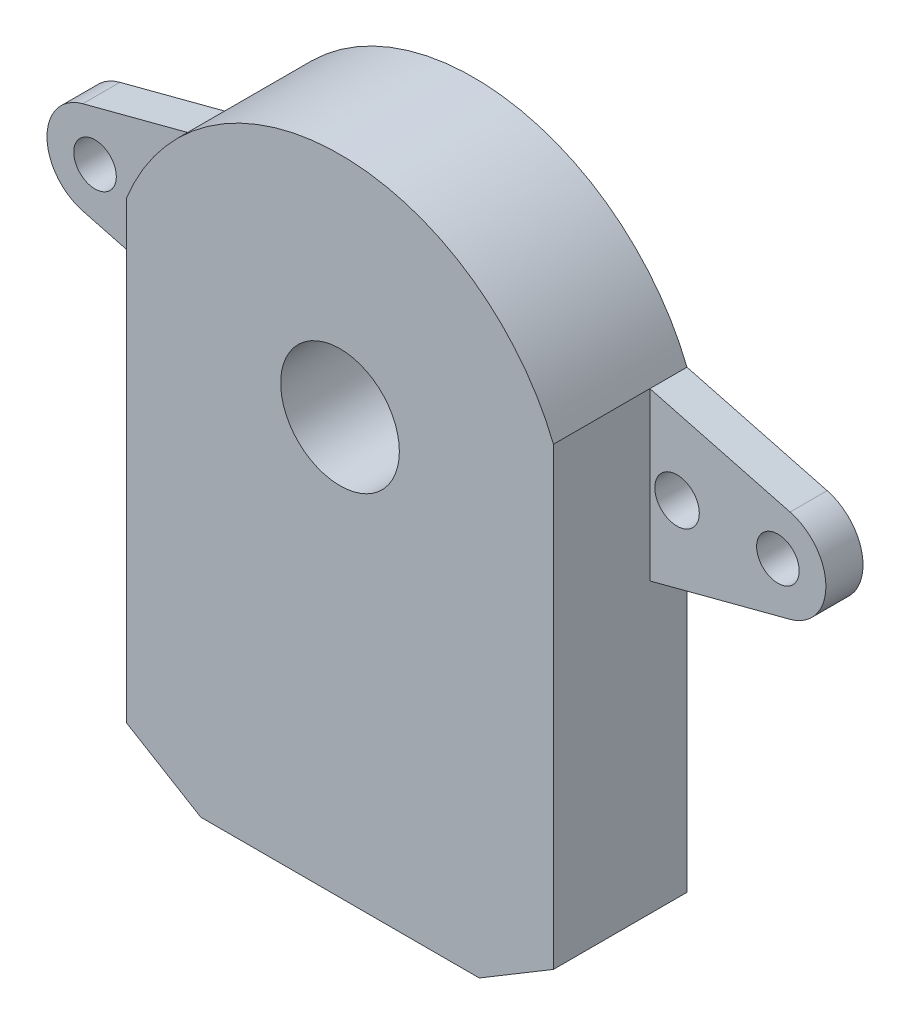
ISO-10303-21;
HEADER;
FILE_DESCRIPTION(('STEP AP214'),'2;1');
FILE_NAME('part.step','',(''),(''),'','','');
FILE_SCHEMA(('AUTOMOTIVE_DESIGN { 1 0 10303 214 1 1 1 1 }'));
ENDSEC;
DATA;
#1=APPLICATION_CONTEXT('core data for automotive mechanical design processes');
#2=APPLICATION_PROTOCOL_DEFINITION('international standard','automotive_design',2000,#1);
#3=PRODUCT_CONTEXT('',#1,'mechanical');
#4=PRODUCT('Part','Part','',(#3));
#5=PRODUCT_RELATED_PRODUCT_CATEGORY('part','',(#4));
#6=PRODUCT_DEFINITION_FORMATION('','',#4);
#7=PRODUCT_DEFINITION_CONTEXT('part definition',#1,'design');
#8=PRODUCT_DEFINITION('design','',#6,#7);
#9=PRODUCT_DEFINITION_SHAPE('','',#8);
#10=(LENGTH_UNIT() NAMED_UNIT(*) SI_UNIT(.MILLI.,.METRE.));
#11=(NAMED_UNIT(*) PLANE_ANGLE_UNIT() SI_UNIT($,.RADIAN.));
#12=(NAMED_UNIT(*) SI_UNIT($,.STERADIAN.) SOLID_ANGLE_UNIT());
#13=UNCERTAINTY_MEASURE_WITH_UNIT(LENGTH_MEASURE(1.E-05),#10,'distance_accuracy_value','');
#14=(GEOMETRIC_REPRESENTATION_CONTEXT(3) GLOBAL_UNCERTAINTY_ASSIGNED_CONTEXT((#13)) GLOBAL_UNIT_ASSIGNED_CONTEXT((#10,
#11,#12)) REPRESENTATION_CONTEXT('',''));
#15=CARTESIAN_POINT('',(0.,0.,0.));
#16=DIRECTION('',(0.,0.,1.));
#17=DIRECTION('',(1.,0.,0.));
#18=AXIS2_PLACEMENT_3D('',#15,#16,#17);
#19=CARTESIAN_POINT('',(-14.385,5.61250162407946,9.));
#20=DIRECTION('',(0.253955475555715,-0.967215909937006,0.));
#21=DIRECTION('',(0.967215909937006,0.253955475555716,0.));
#22=AXIS2_PLACEMENT_3D('',#19,#20,#21);
#23=PLANE('',#22);
#24=DIRECTION('',(-0.967215909937006,-0.253955475555715,0.));
#25=VECTOR('',#24,1.);
#26=CARTESIAN_POINT('',(-14.385,5.61250162407946,2.5));
#27=LINE('',#26,#25);
#28=CARTESIAN_POINT('',(-14.385,5.61250162407946,2.5));
#29=VERTEX_POINT('',#28);
#30=CARTESIAN_POINT('',(-23.8346808521116,3.13136150842106,2.5));
#31=VERTEX_POINT('',#30);
#32=EDGE_CURVE('E267',#29,#31,#27,.T.);
#33=ORIENTED_EDGE('',*,*,#32,.F.);
#34=DIRECTION('',(0.,0.,-1.));
#35=VECTOR('',#34,1.);
#36=CARTESIAN_POINT('',(-14.385,5.61250162407946,9.));
#37=LINE('',#36,#35);
#38=CARTESIAN_POINT('',(-14.385,5.61250162407946,0.));
#39=VERTEX_POINT('',#38);
#40=EDGE_CURVE('E180',#29,#39,#37,.T.);
#41=ORIENTED_EDGE('',*,*,#40,.T.);
#42=DIRECTION('',(-0.967215909937006,-0.253955475555715,0.));
#43=VECTOR('',#42,1.);
#44=CARTESIAN_POINT('',(-14.385,5.61250162407946,0.));
#45=LINE('',#44,#43);
#46=CARTESIAN_POINT('',(-23.8346808521116,3.13136150842106,0.));
#47=VERTEX_POINT('',#46);
#48=EDGE_CURVE('E243',#39,#47,#45,.T.);
#49=ORIENTED_EDGE('',*,*,#48,.T.);
#50=DIRECTION('',(0.,0.,-1.));
#51=VECTOR('',#50,1.);
#52=CARTESIAN_POINT('',(-23.8346808521116,3.13136150842106,9.));
#53=LINE('',#52,#51);
#54=EDGE_CURVE('E178',#31,#47,#53,.T.);
#55=ORIENTED_EDGE('',*,*,#54,.F.);
#56=EDGE_LOOP('',(#33,#41,#49,#55));
#57=FACE_BOUND('',#56,.T.);
#58=ADVANCED_FACE('F35',(#57),#23,.F.);
#59=CARTESIAN_POINT('',(-23.0125,0.,9.));
#60=DIRECTION('',(0.,0.,-1.));
#61=DIRECTION('',(-1.,0.,0.));
#62=AXIS2_PLACEMENT_3D('',#59,#60,#61);
#63=CYLINDRICAL_SURFACE('',#62,3.2375);
#64=CARTESIAN_POINT('',(-23.0125,0.,2.5));
#65=DIRECTION('',(0.,0.,1.));
#66=DIRECTION('',(1.,0.,0.));
#67=AXIS2_PLACEMENT_3D('',#64,#65,#66);
#68=CIRCLE('',#67,3.23750000000001);
#69=CARTESIAN_POINT('',(-23.8346808521116,-3.13136150842107,2.5));
#70=VERTEX_POINT('',#69);
#71=EDGE_CURVE('E273',#31,#70,#68,.T.);
#72=ORIENTED_EDGE('',*,*,#71,.F.);
#73=ORIENTED_EDGE('',*,*,#54,.T.);
#74=CARTESIAN_POINT('',(-23.0125,0.,0.));
#75=DIRECTION('',(0.,0.,1.));
#76=DIRECTION('',(1.,0.,0.));
#77=AXIS2_PLACEMENT_3D('',#74,#75,#76);
#78=CIRCLE('',#77,3.2375);
#79=CARTESIAN_POINT('',(-23.8346808521116,-3.13136150842106,0.));
#80=VERTEX_POINT('',#79);
#81=EDGE_CURVE('E247',#47,#80,#78,.T.);
#82=ORIENTED_EDGE('',*,*,#81,.T.);
#83=DIRECTION('',(0.,0.,-1.));
#84=VECTOR('',#83,1.);
#85=CARTESIAN_POINT('',(-23.8346808521116,-3.13136150842106,9.));
#86=LINE('',#85,#84);
#87=EDGE_CURVE('E176',#70,#80,#86,.T.);
#88=ORIENTED_EDGE('',*,*,#87,.F.);
#89=EDGE_LOOP('',(#72,#73,#82,#88));
#90=FACE_BOUND('',#89,.T.);
#91=ADVANCED_FACE('F276',(#90),#63,.T.);
#92=CARTESIAN_POINT('',(-23.8346808521116,-3.13136150842106,9.));
#93=DIRECTION('',(0.253955475555715,0.967215909937006,0.));
#94=DIRECTION('',(-0.967215909937006,0.253955475555715,0.));
#95=AXIS2_PLACEMENT_3D('',#92,#93,#94);
#96=PLANE('',#95);
#97=DIRECTION('',(0.967215909937006,-0.253955475555714,0.));
#98=VECTOR('',#97,1.);
#99=CARTESIAN_POINT('',(-23.8346808521116,-3.13136150842107,2.5));
#100=LINE('',#99,#98);
#101=CARTESIAN_POINT('',(-14.385,-5.61250162407945,2.5));
#102=VERTEX_POINT('',#101);
#103=EDGE_CURVE('E150',#70,#102,#100,.T.);
#104=ORIENTED_EDGE('',*,*,#103,.F.);
#105=ORIENTED_EDGE('',*,*,#87,.T.);
#106=DIRECTION('',(0.967215909937006,-0.253955475555715,0.));
#107=VECTOR('',#106,1.);
#108=CARTESIAN_POINT('',(-23.8346808521116,-3.13136150842106,0.));
#109=LINE('',#108,#107);
#110=CARTESIAN_POINT('',(-14.385,-5.61250162407945,0.));
#111=VERTEX_POINT('',#110);
#112=EDGE_CURVE('E222',#80,#111,#109,.T.);
#113=ORIENTED_EDGE('',*,*,#112,.T.);
#114=DIRECTION('',(0.,0.,-1.));
#115=VECTOR('',#114,1.);
#116=CARTESIAN_POINT('',(-14.385,-5.61250162407945,9.));
#117=LINE('',#116,#115);
#118=EDGE_CURVE('E174',#102,#111,#117,.T.);
#119=ORIENTED_EDGE('',*,*,#118,.F.);
#120=EDGE_LOOP('',(#104,#105,#113,#119));
#121=FACE_BOUND('',#120,.T.);
#122=ADVANCED_FACE('F254',(#121),#96,.F.);
#123=CARTESIAN_POINT('',(23.8346808521116,-3.13136150842106,9.));
#124=DIRECTION('',(-0.253955475555715,0.967215909937006,0.));
#125=DIRECTION('',(-0.967215909937006,-0.253955475555716,0.));
#126=AXIS2_PLACEMENT_3D('',#123,#124,#125);
#127=PLANE('',#126);
#128=DIRECTION('',(0.967215909937006,0.253955475555715,0.));
#129=VECTOR('',#128,1.);
#130=CARTESIAN_POINT('',(14.385,-5.61250162407946,2.5));
#131=LINE('',#130,#129);
#132=CARTESIAN_POINT('',(14.385,-5.61250162407946,2.5));
#133=VERTEX_POINT('',#132);
#134=CARTESIAN_POINT('',(23.8346808521116,-3.13136150842106,2.5));
#135=VERTEX_POINT('',#134);
#136=EDGE_CURVE('E140',#133,#135,#131,.T.);
#137=ORIENTED_EDGE('',*,*,#136,.F.);
#138=DIRECTION('',(0.,0.,-1.));
#139=VECTOR('',#138,1.);
#140=CARTESIAN_POINT('',(14.385,-5.61250162407946,9.));
#141=LINE('',#140,#139);
#142=CARTESIAN_POINT('',(14.385,-5.61250162407946,0.));
#143=VERTEX_POINT('',#142);
#144=EDGE_CURVE('E137',#133,#143,#141,.T.);
#145=ORIENTED_EDGE('',*,*,#144,.T.);
#146=DIRECTION('',(0.967215909937006,0.253955475555715,0.));
#147=VECTOR('',#146,1.);
#148=CARTESIAN_POINT('',(23.8346808521116,-3.13136150842106,0.));
#149=LINE('',#148,#147);
#150=CARTESIAN_POINT('',(23.8346808521116,-3.13136150842106,0.));
#151=VERTEX_POINT('',#150);
#152=EDGE_CURVE('E220',#143,#151,#149,.T.);
#153=ORIENTED_EDGE('',*,*,#152,.T.);
#154=DIRECTION('',(0.,0.,-1.));
#155=VECTOR('',#154,1.);
#156=CARTESIAN_POINT('',(23.8346808521116,-3.13136150842106,9.));
#157=LINE('',#156,#155);
#158=EDGE_CURVE('E167',#135,#151,#157,.T.);
#159=ORIENTED_EDGE('',*,*,#158,.F.);
#160=EDGE_LOOP('',(#137,#145,#153,#159));
#161=FACE_BOUND('',#160,.T.);
#162=ADVANCED_FACE('F337',(#161),#127,.F.);
#163=CARTESIAN_POINT('',(23.0125,0.,9.));
#164=DIRECTION('',(0.,0.,-1.));
#165=DIRECTION('',(-1.,0.,0.));
#166=AXIS2_PLACEMENT_3D('',#163,#164,#165);
#167=CYLINDRICAL_SURFACE('',#166,3.2375);
#168=CARTESIAN_POINT('',(23.0125,0.,2.5));
#169=DIRECTION('',(0.,0.,1.));
#170=DIRECTION('',(1.,0.,0.));
#171=AXIS2_PLACEMENT_3D('',#168,#169,#170);
#172=CIRCLE('',#171,3.2375);
#173=CARTESIAN_POINT('',(23.8346808521116,3.13136150842106,2.5));
#174=VERTEX_POINT('',#173);
#175=EDGE_CURVE('E147',#135,#174,#172,.T.);
#176=ORIENTED_EDGE('',*,*,#175,.F.);
#177=ORIENTED_EDGE('',*,*,#158,.T.);
#178=CARTESIAN_POINT('',(23.0125,0.,0.));
#179=DIRECTION('',(0.,0.,1.));
#180=DIRECTION('',(-1.,0.,0.));
#181=AXIS2_PLACEMENT_3D('',#178,#179,#180);
#182=CIRCLE('',#181,3.2375);
#183=CARTESIAN_POINT('',(23.8346808521116,3.13136150842106,0.));
#184=VERTEX_POINT('',#183);
#185=EDGE_CURVE('E227',#151,#184,#182,.T.);
#186=ORIENTED_EDGE('',*,*,#185,.T.);
#187=DIRECTION('',(0.,0.,-1.));
#188=VECTOR('',#187,1.);
#189=CARTESIAN_POINT('',(23.8346808521116,3.13136150842106,9.));
#190=LINE('',#189,#188);
#191=EDGE_CURVE('E166',#174,#184,#190,.T.);
#192=ORIENTED_EDGE('',*,*,#191,.F.);
#193=EDGE_LOOP('',(#176,#177,#186,#192));
#194=FACE_BOUND('',#193,.T.);
#195=ADVANCED_FACE('F340',(#194),#167,.T.);
#196=CARTESIAN_POINT('',(14.385,5.61250162407946,9.));
#197=DIRECTION('',(-0.253955475555716,-0.967215909937006,0.));
#198=DIRECTION('',(0.967215909937006,-0.253955475555716,0.));
#199=AXIS2_PLACEMENT_3D('',#196,#197,#198);
#200=PLANE('',#199);
#201=DIRECTION('',(-0.967215909937006,0.253955475555716,0.));
#202=VECTOR('',#201,1.);
#203=CARTESIAN_POINT('',(23.8346808521116,3.13136150842106,2.5));
#204=LINE('',#203,#202);
#205=CARTESIAN_POINT('',(14.385,5.61250162407946,2.5));
#206=VERTEX_POINT('',#205);
#207=EDGE_CURVE('E141',#174,#206,#204,.T.);
#208=ORIENTED_EDGE('',*,*,#207,.F.);
#209=ORIENTED_EDGE('',*,*,#191,.T.);
#210=DIRECTION('',(-0.967215909937006,0.253955475555716,0.));
#211=VECTOR('',#210,1.);
#212=CARTESIAN_POINT('',(14.385,5.61250162407946,0.));
#213=LINE('',#212,#211);
#214=CARTESIAN_POINT('',(14.385,5.61250162407946,0.));
#215=VERTEX_POINT('',#214);
#216=EDGE_CURVE('E156',#184,#215,#213,.T.);
#217=ORIENTED_EDGE('',*,*,#216,.T.);
#218=DIRECTION('',(0.,0.,-1.));
#219=VECTOR('',#218,1.);
#220=CARTESIAN_POINT('',(14.385,5.61250162407946,9.));
#221=LINE('',#220,#219);
#222=EDGE_CURVE('E153',#206,#215,#221,.T.);
#223=ORIENTED_EDGE('',*,*,#222,.F.);
#224=EDGE_LOOP('',(#208,#209,#217,#223));
#225=FACE_BOUND('',#224,.T.);
#226=ADVANCED_FACE('F154',(#225),#200,.F.);
#227=CARTESIAN_POINT('',(-23.0125,0.,9.));
#228=DIRECTION('',(0.,0.,-1.));
#229=DIRECTION('',(-1.,0.,0.));
#230=AXIS2_PLACEMENT_3D('',#227,#228,#229);
#231=CYLINDRICAL_SURFACE('',#230,1.435);
#232=CARTESIAN_POINT('',(-23.0125,0.,0.));
#233=DIRECTION('',(0.,0.,1.));
#234=DIRECTION('',(1.,0.,0.));
#235=AXIS2_PLACEMENT_3D('',#232,#233,#234);
#236=CIRCLE('',#235,1.435);
#237=CARTESIAN_POINT('',(-21.5775,0.,0.));
#238=VERTEX_POINT('',#237);
#239=EDGE_CURVE('E293',#238,#238,#236,.T.);
#240=ORIENTED_EDGE('',*,*,#239,.F.);
#241=EDGE_LOOP('',(#240));
#242=FACE_BOUND('',#241,.T.);
#243=CARTESIAN_POINT('',(-23.0125,0.,2.5));
#244=DIRECTION('',(0.,0.,1.));
#245=DIRECTION('',(1.,0.,0.));
#246=AXIS2_PLACEMENT_3D('',#243,#244,#245);
#247=CIRCLE('',#246,1.435);
#248=CARTESIAN_POINT('',(-21.5775,0.,2.5));
#249=VERTEX_POINT('',#248);
#250=EDGE_CURVE('E187',#249,#249,#247,.T.);
#251=ORIENTED_EDGE('',*,*,#250,.T.);
#252=EDGE_LOOP('',(#251));
#253=FACE_BOUND('',#252,.T.);
#254=ADVANCED_FACE('F347',(#242,#253),#231,.F.);
#255=CARTESIAN_POINT('',(23.0125,0.,9.));
#256=DIRECTION('',(0.,0.,-1.));
#257=DIRECTION('',(-1.,0.,0.));
#258=AXIS2_PLACEMENT_3D('',#255,#256,#257);
#259=CYLINDRICAL_SURFACE('',#258,1.43499999999999);
#260=CARTESIAN_POINT('',(23.0125,0.,0.));
#261=DIRECTION('',(0.,0.,1.));
#262=DIRECTION('',(1.,0.,0.));
#263=AXIS2_PLACEMENT_3D('',#260,#261,#262);
#264=CIRCLE('',#263,1.43499999999999);
#265=CARTESIAN_POINT('',(24.4475,0.,0.));
#266=VERTEX_POINT('',#265);
#267=EDGE_CURVE('E290',#266,#266,#264,.T.);
#268=ORIENTED_EDGE('',*,*,#267,.F.);
#269=EDGE_LOOP('',(#268));
#270=FACE_BOUND('',#269,.T.);
#271=CARTESIAN_POINT('',(23.0125,0.,2.5));
#272=DIRECTION('',(0.,0.,1.));
#273=DIRECTION('',(1.,0.,0.));
#274=AXIS2_PLACEMENT_3D('',#271,#272,#273);
#275=CIRCLE('',#274,1.43499999999999);
#276=CARTESIAN_POINT('',(24.4475,0.,2.5));
#277=VERTEX_POINT('',#276);
#278=EDGE_CURVE('E191',#277,#277,#275,.T.);
#279=ORIENTED_EDGE('',*,*,#278,.T.);
#280=EDGE_LOOP('',(#279));
#281=FACE_BOUND('',#280,.T.);
#282=ADVANCED_FACE('F383',(#270,#281),#259,.F.);
#283=CARTESIAN_POINT('',(16.215,0.,9.));
#284=DIRECTION('',(0.,0.,-1.));
#285=DIRECTION('',(-1.,0.,0.));
#286=AXIS2_PLACEMENT_3D('',#283,#284,#285);
#287=CYLINDRICAL_SURFACE('',#286,1.5);
#288=CARTESIAN_POINT('',(16.215,0.,0.));
#289=DIRECTION('',(0.,0.,1.));
#290=DIRECTION('',(-1.,0.,0.));
#291=AXIS2_PLACEMENT_3D('',#288,#289,#290);
#292=CIRCLE('',#291,1.5);
#293=CARTESIAN_POINT('',(14.715,0.,0.));
#294=VERTEX_POINT('',#293);
#295=EDGE_CURVE('E287',#294,#294,#292,.T.);
#296=ORIENTED_EDGE('',*,*,#295,.F.);
#297=EDGE_LOOP('',(#296));
#298=FACE_BOUND('',#297,.T.);
#299=CARTESIAN_POINT('',(16.215,0.,2.5));
#300=DIRECTION('',(0.,0.,1.));
#301=DIRECTION('',(1.,0.,0.));
#302=AXIS2_PLACEMENT_3D('',#299,#300,#301);
#303=CIRCLE('',#302,1.5);
#304=CARTESIAN_POINT('',(17.715,0.,2.5));
#305=VERTEX_POINT('',#304);
#306=EDGE_CURVE('E188',#305,#305,#303,.T.);
#307=ORIENTED_EDGE('',*,*,#306,.T.);
#308=EDGE_LOOP('',(#307));
#309=FACE_BOUND('',#308,.T.);
#310=ADVANCED_FACE('F392',(#298,#309),#287,.F.);
#311=CARTESIAN_POINT('',(-16.215,0.,9.));
#312=DIRECTION('',(0.,0.,-1.));
#313=DIRECTION('',(-1.,0.,0.));
#314=AXIS2_PLACEMENT_3D('',#311,#312,#313);
#315=CYLINDRICAL_SURFACE('',#314,1.5);
#316=CARTESIAN_POINT('',(-16.215,0.,0.));
#317=DIRECTION('',(0.,0.,1.));
#318=DIRECTION('',(1.,0.,0.));
#319=AXIS2_PLACEMENT_3D('',#316,#317,#318);
#320=CIRCLE('',#319,1.5);
#321=CARTESIAN_POINT('',(-14.715,0.,0.));
#322=VERTEX_POINT('',#321);
#323=EDGE_CURVE('E284',#322,#322,#320,.T.);
#324=ORIENTED_EDGE('',*,*,#323,.F.);
#325=EDGE_LOOP('',(#324));
#326=FACE_BOUND('',#325,.T.);
#327=CARTESIAN_POINT('',(-16.215,0.,2.5));
#328=DIRECTION('',(0.,0.,1.));
#329=DIRECTION('',(1.,0.,0.));
#330=AXIS2_PLACEMENT_3D('',#327,#328,#329);
#331=CIRCLE('',#330,1.5);
#332=CARTESIAN_POINT('',(-14.715,0.,2.5));
#333=VERTEX_POINT('',#332);
#334=EDGE_CURVE('E184',#333,#333,#331,.T.);
#335=ORIENTED_EDGE('',*,*,#334,.T.);
#336=EDGE_LOOP('',(#335));
#337=FACE_BOUND('',#336,.T.);
#338=ADVANCED_FACE('F402',(#326,#337),#315,.F.);
#339=CARTESIAN_POINT('',(0.,-0.16,9.));
#340=DIRECTION('',(0.,0.,1.));
#341=DIRECTION('',(1.,0.,0.));
#342=AXIS2_PLACEMENT_3D('',#339,#340,#341);
#343=PLANE('',#342);
#344=DIRECTION('',(0.,-1.,0.));
#345=VECTOR('',#344,1.);
#346=CARTESIAN_POINT('',(-14.385,-28.04,9.));
#347=LINE('',#346,#345);
#348=CARTESIAN_POINT('',(-14.385,5.61250162407946,9.));
#349=VERTEX_POINT('',#348);
#350=CARTESIAN_POINT('',(-14.385,-25.04,9.));
#351=VERTEX_POINT('',#350);
#352=EDGE_CURVE('E231',#349,#351,#347,.T.);
#353=ORIENTED_EDGE('',*,*,#352,.T.);
#354=DIRECTION('',(-0.857492925712545,0.514495755427525,0.));
#355=VECTOR('',#354,1.);
#356=CARTESIAN_POINT('',(-14.7842647058823,-24.8004411764706,9.));
#357=LINE('',#356,#355);
#358=CARTESIAN_POINT('',(-9.38499999999996,-28.04,9.));
#359=VERTEX_POINT('',#358);
#360=EDGE_CURVE('E11',#351,#359,#357,.F.);
#361=ORIENTED_EDGE('',*,*,#360,.T.);
#362=DIRECTION('',(1.,0.,0.));
#363=VECTOR('',#362,1.);
#364=CARTESIAN_POINT('',(14.385,-28.04,9.));
#365=LINE('',#364,#363);
#366=CARTESIAN_POINT('',(9.38500000000002,-28.04,9.));
#367=VERTEX_POINT('',#366);
#368=EDGE_CURVE('E210',#359,#367,#365,.T.);
#369=ORIENTED_EDGE('',*,*,#368,.T.);
#370=DIRECTION('',(-0.857492925712545,-0.514495755427525,0.));
#371=VECTOR('',#370,1.);
#372=CARTESIAN_POINT('',(14.7842647058823,-24.8004411764706,9.));
#373=LINE('',#372,#371);
#374=CARTESIAN_POINT('',(14.385,-25.04,9.));
#375=VERTEX_POINT('',#374);
#376=EDGE_CURVE('E200',#367,#375,#373,.F.);
#377=ORIENTED_EDGE('',*,*,#376,.T.);
#378=DIRECTION('',(0.,1.,0.));
#379=VECTOR('',#378,1.);
#380=CARTESIAN_POINT('',(14.385,-28.04,9.));
#381=LINE('',#380,#379);
#382=CARTESIAN_POINT('',(14.385,5.61250162407946,9.));
#383=VERTEX_POINT('',#382);
#384=EDGE_CURVE('E160',#375,#383,#381,.T.);
#385=ORIENTED_EDGE('',*,*,#384,.T.);
#386=CARTESIAN_POINT('',(0.,-0.16,9.));
#387=DIRECTION('',(0.,0.,1.));
#388=DIRECTION('',(1.,0.,0.));
#389=AXIS2_PLACEMENT_3D('',#386,#387,#388);
#390=CIRCLE('',#389,15.5);
#391=EDGE_CURVE('E165',#383,#349,#390,.T.);
#392=ORIENTED_EDGE('',*,*,#391,.T.);
#393=EDGE_LOOP('',(#353,#361,#369,#377,#385,#392));
#394=FACE_BOUND('',#393,.T.);
#395=CARTESIAN_POINT('',(0.,0.,9.));
#396=DIRECTION('',(0.,0.,1.));
#397=DIRECTION('',(1.,0.,0.));
#398=AXIS2_PLACEMENT_3D('',#395,#396,#397);
#399=CIRCLE('',#398,4.);
#400=CARTESIAN_POINT('',(4.,0.,9.));
#401=VERTEX_POINT('',#400);
#402=EDGE_CURVE('E244',#401,#401,#399,.T.);
#403=ORIENTED_EDGE('',*,*,#402,.F.);
#404=EDGE_LOOP('',(#403));
#405=FACE_BOUND('',#404,.T.);
#406=ADVANCED_FACE('F259',(#394,#405),#343,.T.);
#407=CARTESIAN_POINT('',(0.,-0.16,0.));
#408=DIRECTION('',(0.,0.,1.));
#409=DIRECTION('',(1.,0.,0.));
#410=AXIS2_PLACEMENT_3D('',#407,#408,#409);
#411=PLANE('',#410);
#412=DIRECTION('',(1.,0.,0.));
#413=VECTOR('',#412,1.);
#414=CARTESIAN_POINT('',(14.385,-28.04,0.));
#415=LINE('',#414,#413);
#416=CARTESIAN_POINT('',(-9.38499999999996,-28.04,0.));
#417=VERTEX_POINT('',#416);
#418=CARTESIAN_POINT('',(9.38500000000002,-28.04,0.));
#419=VERTEX_POINT('',#418);
#420=EDGE_CURVE('E209',#417,#419,#415,.T.);
#421=ORIENTED_EDGE('',*,*,#420,.F.);
#422=DIRECTION('',(0.857492925712545,-0.514495755427525,0.));
#423=VECTOR('',#422,1.);
#424=CARTESIAN_POINT('',(-9.38499999999997,-28.04,0.));
#425=LINE('',#424,#423);
#426=CARTESIAN_POINT('',(-14.385,-25.04,0.));
#427=VERTEX_POINT('',#426);
#428=EDGE_CURVE('E57',#417,#427,#425,.F.);
#429=ORIENTED_EDGE('',*,*,#428,.T.);
#430=DIRECTION('',(0.,-1.,0.));
#431=VECTOR('',#430,1.);
#432=CARTESIAN_POINT('',(-14.385,-28.04,0.));
#433=LINE('',#432,#431);
#434=EDGE_CURVE('E218',#111,#427,#433,.T.);
#435=ORIENTED_EDGE('',*,*,#434,.F.);
#436=ORIENTED_EDGE('',*,*,#112,.F.);
#437=ORIENTED_EDGE('',*,*,#81,.F.);
#438=ORIENTED_EDGE('',*,*,#48,.F.);
#439=CARTESIAN_POINT('',(0.,-0.16,0.));
#440=DIRECTION('',(0.,0.,1.));
#441=DIRECTION('',(1.,0.,0.));
#442=AXIS2_PLACEMENT_3D('',#439,#440,#441);
#443=CIRCLE('',#442,15.5);
#444=EDGE_CURVE('E241',#215,#39,#443,.T.);
#445=ORIENTED_EDGE('',*,*,#444,.F.);
#446=ORIENTED_EDGE('',*,*,#216,.F.);
#447=ORIENTED_EDGE('',*,*,#185,.F.);
#448=ORIENTED_EDGE('',*,*,#152,.F.);
#449=DIRECTION('',(0.,1.,0.));
#450=VECTOR('',#449,1.);
#451=CARTESIAN_POINT('',(14.385,-28.04,0.));
#452=LINE('',#451,#450);
#453=CARTESIAN_POINT('',(14.385,-25.04,0.));
#454=VERTEX_POINT('',#453);
#455=EDGE_CURVE('E217',#454,#143,#452,.T.);
#456=ORIENTED_EDGE('',*,*,#455,.F.);
#457=DIRECTION('',(0.857492925712545,0.514495755427525,0.));
#458=VECTOR('',#457,1.);
#459=CARTESIAN_POINT('',(14.385,-25.04,0.));
#460=LINE('',#459,#458);
#461=EDGE_CURVE('E194',#454,#419,#460,.F.);
#462=ORIENTED_EDGE('',*,*,#461,.T.);
#463=EDGE_LOOP('',(#421,#429,#435,#436,#437,#438,#445,#446,#447,#448,#456,#462));
#464=FACE_BOUND('',#463,.T.);
#465=CARTESIAN_POINT('',(0.,0.,0.));
#466=DIRECTION('',(0.,0.,1.));
#467=DIRECTION('',(1.,0.,0.));
#468=AXIS2_PLACEMENT_3D('',#465,#466,#467);
#469=CIRCLE('',#468,4.);
#470=CARTESIAN_POINT('',(4.,0.,0.));
#471=VERTEX_POINT('',#470);
#472=EDGE_CURVE('E236',#471,#471,#469,.T.);
#473=ORIENTED_EDGE('',*,*,#472,.T.);
#474=EDGE_LOOP('',(#473));
#475=FACE_BOUND('',#474,.T.);
#476=ORIENTED_EDGE('',*,*,#239,.T.);
#477=EDGE_LOOP('',(#476));
#478=FACE_BOUND('',#477,.T.);
#479=ORIENTED_EDGE('',*,*,#267,.T.);
#480=EDGE_LOOP('',(#479));
#481=FACE_BOUND('',#480,.T.);
#482=ORIENTED_EDGE('',*,*,#295,.T.);
#483=EDGE_LOOP('',(#482));
#484=FACE_BOUND('',#483,.T.);
#485=ORIENTED_EDGE('',*,*,#323,.T.);
#486=EDGE_LOOP('',(#485));
#487=FACE_BOUND('',#486,.T.);
#488=ADVANCED_FACE('F213',(#464,#475,#478,#481,#484,#487),#411,.F.);
#489=CARTESIAN_POINT('',(0.,-0.16,9.));
#490=DIRECTION('',(0.,0.,-1.));
#491=DIRECTION('',(-1.,0.,0.));
#492=AXIS2_PLACEMENT_3D('',#489,#490,#491);
#493=CYLINDRICAL_SURFACE('',#492,15.5);
#494=ORIENTED_EDGE('',*,*,#444,.T.);
#495=ORIENTED_EDGE('',*,*,#40,.F.);
#496=EDGE_CURVE('E181',#349,#29,#37,.T.);
#497=ORIENTED_EDGE('',*,*,#496,.F.);
#498=ORIENTED_EDGE('',*,*,#391,.F.);
#499=EDGE_CURVE('E134',#383,#206,#221,.T.);
#500=ORIENTED_EDGE('',*,*,#499,.T.);
#501=ORIENTED_EDGE('',*,*,#222,.T.);
#502=EDGE_LOOP('',(#494,#495,#497,#498,#500,#501));
#503=FACE_BOUND('',#502,.T.);
#504=ADVANCED_FACE('F162',(#503),#493,.T.);
#505=CARTESIAN_POINT('',(-14.385,-28.04,9.));
#506=DIRECTION('',(1.,0.,0.));
#507=DIRECTION('',(0.,1.,0.));
#508=AXIS2_PLACEMENT_3D('',#505,#506,#507);
#509=PLANE('',#508);
#510=ORIENTED_EDGE('',*,*,#434,.T.);
#511=DIRECTION('',(0.,0.,1.));
#512=VECTOR('',#511,1.);
#513=CARTESIAN_POINT('',(-14.385,-25.04,9.));
#514=LINE('',#513,#512);
#515=EDGE_CURVE('E43',#427,#351,#514,.T.);
#516=ORIENTED_EDGE('',*,*,#515,.T.);
#517=ORIENTED_EDGE('',*,*,#352,.F.);
#518=ORIENTED_EDGE('',*,*,#496,.T.);
#519=DIRECTION('',(0.,1.,0.));
#520=VECTOR('',#519,1.);
#521=CARTESIAN_POINT('',(-14.385,5.61250162407946,2.5));
#522=LINE('',#521,#520);
#523=EDGE_CURVE('E262',#102,#29,#522,.T.);
#524=ORIENTED_EDGE('',*,*,#523,.F.);
#525=ORIENTED_EDGE('',*,*,#118,.T.);
#526=EDGE_LOOP('',(#510,#516,#517,#518,#524,#525));
#527=FACE_BOUND('',#526,.T.);
#528=ADVANCED_FACE('F257',(#527),#509,.F.);
#529=CARTESIAN_POINT('',(14.385,-28.04,9.));
#530=DIRECTION('',(0.,1.,0.));
#531=DIRECTION('',(-1.,0.,0.));
#532=AXIS2_PLACEMENT_3D('',#529,#530,#531);
#533=PLANE('',#532);
#534=ORIENTED_EDGE('',*,*,#368,.F.);
#535=DIRECTION('',(0.,0.,-1.));
#536=VECTOR('',#535,1.);
#537=CARTESIAN_POINT('',(-9.38499999999997,-28.04,9.));
#538=LINE('',#537,#536);
#539=EDGE_CURVE('E202',#359,#417,#538,.T.);
#540=ORIENTED_EDGE('',*,*,#539,.T.);
#541=ORIENTED_EDGE('',*,*,#420,.T.);
#542=DIRECTION('',(0.,0.,1.));
#543=VECTOR('',#542,1.);
#544=CARTESIAN_POINT('',(9.38500000000002,-28.04,9.));
#545=LINE('',#544,#543);
#546=EDGE_CURVE('E197',#419,#367,#545,.T.);
#547=ORIENTED_EDGE('',*,*,#546,.T.);
#548=EDGE_LOOP('',(#534,#540,#541,#547));
#549=FACE_BOUND('',#548,.T.);
#550=ADVANCED_FACE('F208',(#549),#533,.F.);
#551=CARTESIAN_POINT('',(14.385,-28.04,9.));
#552=DIRECTION('',(-1.,0.,0.));
#553=DIRECTION('',(0.,-1.,0.));
#554=AXIS2_PLACEMENT_3D('',#551,#552,#553);
#555=PLANE('',#554);
#556=ORIENTED_EDGE('',*,*,#384,.F.);
#557=DIRECTION('',(0.,0.,-1.));
#558=VECTOR('',#557,1.);
#559=CARTESIAN_POINT('',(14.385,-25.04,9.));
#560=LINE('',#559,#558);
#561=EDGE_CURVE('E183',#375,#454,#560,.T.);
#562=ORIENTED_EDGE('',*,*,#561,.T.);
#563=ORIENTED_EDGE('',*,*,#455,.T.);
#564=ORIENTED_EDGE('',*,*,#144,.F.);
#565=DIRECTION('',(0.,-1.,0.));
#566=VECTOR('',#565,1.);
#567=CARTESIAN_POINT('',(14.385,-5.61250162407946,2.5));
#568=LINE('',#567,#566);
#569=EDGE_CURVE('E129',#206,#133,#568,.T.);
#570=ORIENTED_EDGE('',*,*,#569,.F.);
#571=ORIENTED_EDGE('',*,*,#499,.F.);
#572=EDGE_LOOP('',(#556,#562,#563,#564,#570,#571));
#573=FACE_BOUND('',#572,.T.);
#574=ADVANCED_FACE('F132',(#573),#555,.F.);
#575=CARTESIAN_POINT('',(0.,0.,9.));
#576=DIRECTION('',(0.,0.,-1.));
#577=DIRECTION('',(-1.,0.,0.));
#578=AXIS2_PLACEMENT_3D('',#575,#576,#577);
#579=CYLINDRICAL_SURFACE('',#578,4.);
#580=ORIENTED_EDGE('',*,*,#402,.T.);
#581=EDGE_LOOP('',(#580));
#582=FACE_BOUND('',#581,.T.);
#583=ORIENTED_EDGE('',*,*,#472,.F.);
#584=EDGE_LOOP('',(#583));
#585=FACE_BOUND('',#584,.T.);
#586=ADVANCED_FACE('F302',(#582,#585),#579,.F.);
#587=CARTESIAN_POINT('',(-23.0125,0.,2.5));
#588=DIRECTION('',(0.,0.,1.));
#589=DIRECTION('',(1.,0.,0.));
#590=AXIS2_PLACEMENT_3D('',#587,#588,#589);
#591=PLANE('',#590);
#592=ORIENTED_EDGE('',*,*,#250,.F.);
#593=EDGE_LOOP('',(#592));
#594=FACE_BOUND('',#593,.T.);
#595=ORIENTED_EDGE('',*,*,#334,.F.);
#596=EDGE_LOOP('',(#595));
#597=FACE_BOUND('',#596,.T.);
#598=ORIENTED_EDGE('',*,*,#523,.T.);
#599=ORIENTED_EDGE('',*,*,#32,.T.);
#600=ORIENTED_EDGE('',*,*,#71,.T.);
#601=ORIENTED_EDGE('',*,*,#103,.T.);
#602=EDGE_LOOP('',(#598,#599,#600,#601));
#603=FACE_BOUND('',#602,.T.);
#604=ADVANCED_FACE('F266',(#594,#597,#603),#591,.T.);
#605=CARTESIAN_POINT('',(23.0125,0.,2.5));
#606=DIRECTION('',(0.,0.,1.));
#607=DIRECTION('',(1.,0.,0.));
#608=AXIS2_PLACEMENT_3D('',#605,#606,#607);
#609=PLANE('',#608);
#610=ORIENTED_EDGE('',*,*,#278,.F.);
#611=EDGE_LOOP('',(#610));
#612=FACE_BOUND('',#611,.T.);
#613=ORIENTED_EDGE('',*,*,#306,.F.);
#614=EDGE_LOOP('',(#613));
#615=FACE_BOUND('',#614,.T.);
#616=ORIENTED_EDGE('',*,*,#207,.T.);
#617=ORIENTED_EDGE('',*,*,#569,.T.);
#618=ORIENTED_EDGE('',*,*,#136,.T.);
#619=ORIENTED_EDGE('',*,*,#175,.T.);
#620=EDGE_LOOP('',(#616,#617,#618,#619));
#621=FACE_BOUND('',#620,.T.);
#622=ADVANCED_FACE('F145',(#612,#615,#621),#609,.T.);
#623=CARTESIAN_POINT('',(14.385,-25.04,9.));
#624=DIRECTION('',(-0.514495755427525,0.857492925712545,0.));
#625=DIRECTION('',(0.,0.,-1.));
#626=AXIS2_PLACEMENT_3D('',#623,#624,#625);
#627=PLANE('',#626);
#628=ORIENTED_EDGE('',*,*,#376,.F.);
#629=ORIENTED_EDGE('',*,*,#546,.F.);
#630=ORIENTED_EDGE('',*,*,#461,.F.);
#631=ORIENTED_EDGE('',*,*,#561,.F.);
#632=EDGE_LOOP('',(#628,#629,#630,#631));
#633=FACE_BOUND('',#632,.T.);
#634=ADVANCED_FACE('F323',(#633),#627,.F.);
#635=CARTESIAN_POINT('',(-9.38499999999997,-28.04,9.));
#636=DIRECTION('',(0.514495755427525,0.857492925712545,0.));
#637=DIRECTION('',(0.,0.,-1.));
#638=AXIS2_PLACEMENT_3D('',#635,#636,#637);
#639=PLANE('',#638);
#640=ORIENTED_EDGE('',*,*,#360,.F.);
#641=ORIENTED_EDGE('',*,*,#515,.F.);
#642=ORIENTED_EDGE('',*,*,#428,.F.);
#643=ORIENTED_EDGE('',*,*,#539,.F.);
#644=EDGE_LOOP('',(#640,#641,#642,#643));
#645=FACE_BOUND('',#644,.T.);
#646=ADVANCED_FACE('F37',(#645),#639,.F.);
#647=CLOSED_SHELL('',(#58,#91,#122,#162,#195,#226,#254,#282,#310,#338,#406,#488,#504,#528,#550,
#574,#586,#604,#622,#634,#646));
#648=MANIFOLD_SOLID_BREP('B2',#647);
#649=ADVANCED_BREP_SHAPE_REPRESENTATION('',(#18,#648),#14);
#650=SHAPE_DEFINITION_REPRESENTATION(#9,#649);
ENDSEC;
END-ISO-10303-21;
